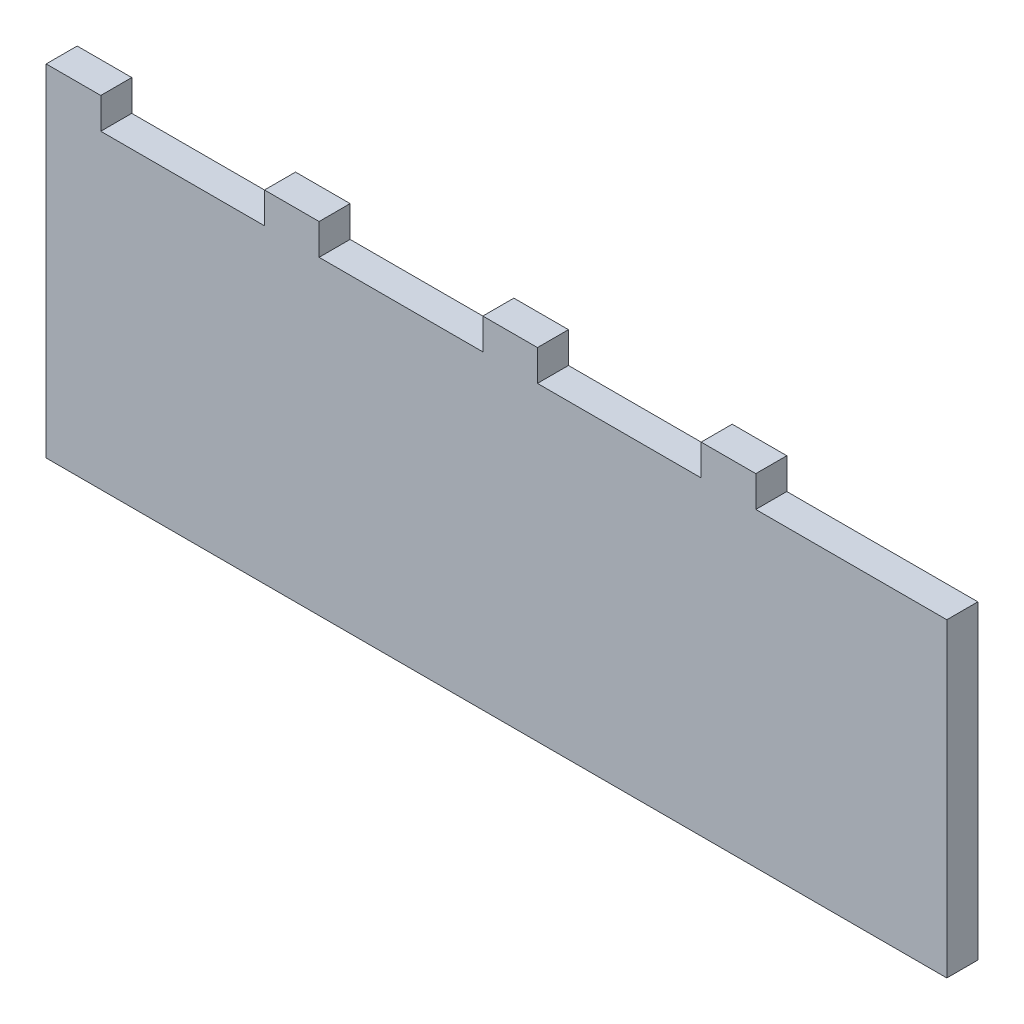
ISO-10303-21;
HEADER;
FILE_DESCRIPTION(('STEP AP214'),'2;1');
FILE_NAME('part.step','',(''),(''),'','','');
FILE_SCHEMA(('AUTOMOTIVE_DESIGN { 1 0 10303 214 1 1 1 1 }'));
ENDSEC;
DATA;
#1=APPLICATION_CONTEXT('core data for automotive mechanical design processes');
#2=APPLICATION_PROTOCOL_DEFINITION('international standard','automotive_design',2000,#1);
#3=PRODUCT_CONTEXT('',#1,'mechanical');
#4=PRODUCT('Part','Part','',(#3));
#5=PRODUCT_RELATED_PRODUCT_CATEGORY('part','',(#4));
#6=PRODUCT_DEFINITION_FORMATION('','',#4);
#7=PRODUCT_DEFINITION_CONTEXT('part definition',#1,'design');
#8=PRODUCT_DEFINITION('design','',#6,#7);
#9=PRODUCT_DEFINITION_SHAPE('','',#8);
#10=(LENGTH_UNIT() NAMED_UNIT(*) SI_UNIT(.MILLI.,.METRE.));
#11=(NAMED_UNIT(*) PLANE_ANGLE_UNIT() SI_UNIT($,.RADIAN.));
#12=(NAMED_UNIT(*) SI_UNIT($,.STERADIAN.) SOLID_ANGLE_UNIT());
#13=UNCERTAINTY_MEASURE_WITH_UNIT(LENGTH_MEASURE(1.E-05),#10,'distance_accuracy_value','');
#14=(GEOMETRIC_REPRESENTATION_CONTEXT(3) GLOBAL_UNCERTAINTY_ASSIGNED_CONTEXT((#13)) GLOBAL_UNIT_ASSIGNED_CONTEXT((#10,
#11,#12)) REPRESENTATION_CONTEXT('',''));
#15=CARTESIAN_POINT('',(0.,0.,0.));
#16=DIRECTION('',(0.,0.,1.));
#17=DIRECTION('',(1.,0.,0.));
#18=AXIS2_PLACEMENT_3D('',#15,#16,#17);
#19=CARTESIAN_POINT('',(15.39291,0.,2.5));
#20=DIRECTION('',(-1.,0.,0.));
#21=DIRECTION('',(0.,-1.,0.));
#22=AXIS2_PLACEMENT_3D('',#19,#20,#21);
#23=PLANE('',#22);
#24=DIRECTION('',(0.,1.,0.));
#25=VECTOR('',#24,1.);
#26=CARTESIAN_POINT('',(15.39291,0.,0.));
#27=LINE('',#26,#25);
#28=CARTESIAN_POINT('',(15.39291,25.,0.));
#29=VERTEX_POINT('',#28);
#30=CARTESIAN_POINT('',(15.39291,27.5,0.));
#31=VERTEX_POINT('',#30);
#32=EDGE_CURVE('E189',#29,#31,#27,.T.);
#33=ORIENTED_EDGE('',*,*,#32,.F.);
#34=DIRECTION('',(0.,0.,-1.));
#35=VECTOR('',#34,1.);
#36=CARTESIAN_POINT('',(15.39291,25.,2.5));
#37=LINE('',#36,#35);
#38=CARTESIAN_POINT('',(15.39291,25.,2.5));
#39=VERTEX_POINT('',#38);
#40=EDGE_CURVE('E11',#39,#29,#37,.T.);
#41=ORIENTED_EDGE('',*,*,#40,.F.);
#42=DIRECTION('',(0.,1.,0.));
#43=VECTOR('',#42,1.);
#44=CARTESIAN_POINT('',(15.39291,0.,2.5));
#45=LINE('',#44,#43);
#46=CARTESIAN_POINT('',(15.39291,27.5,2.5));
#47=VERTEX_POINT('',#46);
#48=EDGE_CURVE('E234',#39,#47,#45,.T.);
#49=ORIENTED_EDGE('',*,*,#48,.T.);
#50=DIRECTION('',(0.,0.,-1.));
#51=VECTOR('',#50,1.);
#52=CARTESIAN_POINT('',(15.39291,27.5,2.5));
#53=LINE('',#52,#51);
#54=EDGE_CURVE('E51',#47,#31,#53,.T.);
#55=ORIENTED_EDGE('',*,*,#54,.T.);
#56=EDGE_LOOP('',(#33,#41,#49,#55));
#57=FACE_BOUND('',#56,.T.);
#58=ADVANCED_FACE('F35',(#57),#23,.T.);
#59=CARTESIAN_POINT('',(0.,25.,2.5));
#60=DIRECTION('',(0.,-1.,0.));
#61=DIRECTION('',(0.,0.,-1.));
#62=AXIS2_PLACEMENT_3D('',#59,#60,#61);
#63=PLANE('',#62);
#64=DIRECTION('',(-1.,0.,0.));
#65=VECTOR('',#64,1.);
#66=CARTESIAN_POINT('',(0.,25.,0.));
#67=LINE('',#66,#65);
#68=CARTESIAN_POINT('',(2.19999999999999,25.,0.));
#69=VERTEX_POINT('',#68);
#70=EDGE_CURVE('E191',#29,#69,#67,.T.);
#71=ORIENTED_EDGE('',*,*,#70,.T.);
#72=DIRECTION('',(0.,0.,-1.));
#73=VECTOR('',#72,1.);
#74=CARTESIAN_POINT('',(2.19999999999999,25.,2.5));
#75=LINE('',#74,#73);
#76=CARTESIAN_POINT('',(2.19999999999999,25.,2.5));
#77=VERTEX_POINT('',#76);
#78=EDGE_CURVE('E43',#77,#69,#75,.T.);
#79=ORIENTED_EDGE('',*,*,#78,.F.);
#80=DIRECTION('',(-1.,0.,0.));
#81=VECTOR('',#80,1.);
#82=CARTESIAN_POINT('',(0.,25.,2.5));
#83=LINE('',#82,#81);
#84=EDGE_CURVE('E291',#39,#77,#83,.T.);
#85=ORIENTED_EDGE('',*,*,#84,.F.);
#86=ORIENTED_EDGE('',*,*,#40,.T.);
#87=EDGE_LOOP('',(#71,#79,#85,#86));
#88=FACE_BOUND('',#87,.T.);
#89=ADVANCED_FACE('F329',(#88),#63,.F.);
#90=CARTESIAN_POINT('',(2.19999999999993,0.,2.5));
#91=DIRECTION('',(-1.,0.,0.));
#92=DIRECTION('',(0.,-1.,0.));
#93=AXIS2_PLACEMENT_3D('',#90,#91,#92);
#94=PLANE('',#93);
#95=DIRECTION('',(0.,1.,0.));
#96=VECTOR('',#95,1.);
#97=CARTESIAN_POINT('',(2.19999999999993,0.,0.));
#98=LINE('',#97,#96);
#99=CARTESIAN_POINT('',(2.2,27.5,0.));
#100=VERTEX_POINT('',#99);
#101=EDGE_CURVE('E193',#69,#100,#98,.T.);
#102=ORIENTED_EDGE('',*,*,#101,.T.);
#103=DIRECTION('',(0.,0.,-1.));
#104=VECTOR('',#103,1.);
#105=CARTESIAN_POINT('',(2.2,27.5,2.5));
#106=LINE('',#105,#104);
#107=CARTESIAN_POINT('',(2.2,27.5,2.5));
#108=VERTEX_POINT('',#107);
#109=EDGE_CURVE('E264',#108,#100,#106,.T.);
#110=ORIENTED_EDGE('',*,*,#109,.F.);
#111=DIRECTION('',(0.,1.,0.));
#112=VECTOR('',#111,1.);
#113=CARTESIAN_POINT('',(2.19999999999993,0.,2.5));
#114=LINE('',#113,#112);
#115=EDGE_CURVE('E272',#77,#108,#114,.T.);
#116=ORIENTED_EDGE('',*,*,#115,.F.);
#117=ORIENTED_EDGE('',*,*,#78,.T.);
#118=EDGE_LOOP('',(#102,#110,#116,#117));
#119=FACE_BOUND('',#118,.T.);
#120=ADVANCED_FACE('F270',(#119),#94,.F.);
#121=CARTESIAN_POINT('',(0.,27.5,2.5));
#122=DIRECTION('',(0.,1.,0.));
#123=DIRECTION('',(0.,0.,1.));
#124=AXIS2_PLACEMENT_3D('',#121,#122,#123);
#125=PLANE('',#124);
#126=DIRECTION('',(1.,0.,0.));
#127=VECTOR('',#126,1.);
#128=CARTESIAN_POINT('',(0.,27.5,0.));
#129=LINE('',#128,#127);
#130=CARTESIAN_POINT('',(-2.2,27.5,0.));
#131=VERTEX_POINT('',#130);
#132=EDGE_CURVE('E196',#131,#100,#129,.T.);
#133=ORIENTED_EDGE('',*,*,#132,.F.);
#134=DIRECTION('',(0.,0.,-1.));
#135=VECTOR('',#134,1.);
#136=CARTESIAN_POINT('',(-2.2,27.5,2.5));
#137=LINE('',#136,#135);
#138=CARTESIAN_POINT('',(-2.2,27.5,2.5));
#139=VERTEX_POINT('',#138);
#140=EDGE_CURVE('E262',#139,#131,#137,.T.);
#141=ORIENTED_EDGE('',*,*,#140,.F.);
#142=DIRECTION('',(1.,0.,0.));
#143=VECTOR('',#142,1.);
#144=CARTESIAN_POINT('',(0.,27.5,2.5));
#145=LINE('',#144,#143);
#146=EDGE_CURVE('E284',#139,#108,#145,.T.);
#147=ORIENTED_EDGE('',*,*,#146,.T.);
#148=ORIENTED_EDGE('',*,*,#109,.T.);
#149=EDGE_LOOP('',(#133,#141,#147,#148));
#150=FACE_BOUND('',#149,.T.);
#151=ADVANCED_FACE('F281',(#150),#125,.T.);
#152=CARTESIAN_POINT('',(-2.2,0.,2.5));
#153=DIRECTION('',(-1.,0.,0.));
#154=DIRECTION('',(0.,0.,1.));
#155=AXIS2_PLACEMENT_3D('',#152,#153,#154);
#156=PLANE('',#155);
#157=DIRECTION('',(0.,1.,0.));
#158=VECTOR('',#157,1.);
#159=CARTESIAN_POINT('',(-2.2,0.,0.));
#160=LINE('',#159,#158);
#161=CARTESIAN_POINT('',(-2.2,0.,0.));
#162=VERTEX_POINT('',#161);
#163=EDGE_CURVE('E199',#162,#131,#160,.T.);
#164=ORIENTED_EDGE('',*,*,#163,.F.);
#165=DIRECTION('',(0.,0.,-1.));
#166=VECTOR('',#165,1.);
#167=CARTESIAN_POINT('',(-2.2,0.,2.5));
#168=LINE('',#167,#166);
#169=CARTESIAN_POINT('',(-2.2,0.,2.5));
#170=VERTEX_POINT('',#169);
#171=EDGE_CURVE('E260',#170,#162,#168,.T.);
#172=ORIENTED_EDGE('',*,*,#171,.F.);
#173=DIRECTION('',(0.,1.,0.));
#174=VECTOR('',#173,1.);
#175=CARTESIAN_POINT('',(-2.2,0.,2.5));
#176=LINE('',#175,#174);
#177=EDGE_CURVE('E287',#170,#139,#176,.T.);
#178=ORIENTED_EDGE('',*,*,#177,.T.);
#179=ORIENTED_EDGE('',*,*,#140,.T.);
#180=EDGE_LOOP('',(#164,#172,#178,#179));
#181=FACE_BOUND('',#180,.T.);
#182=ADVANCED_FACE('F340',(#181),#156,.T.);
#183=CARTESIAN_POINT('',(0.,0.,2.5));
#184=DIRECTION('',(0.,1.,0.));
#185=DIRECTION('',(0.,0.,1.));
#186=AXIS2_PLACEMENT_3D('',#183,#184,#185);
#187=PLANE('',#186);
#188=DIRECTION('',(1.,0.,0.));
#189=VECTOR('',#188,1.);
#190=CARTESIAN_POINT('',(0.,0.,0.));
#191=LINE('',#190,#189);
#192=CARTESIAN_POINT('',(70.3716754404114,0.,0.));
#193=VERTEX_POINT('',#192);
#194=EDGE_CURVE('E202',#162,#193,#191,.T.);
#195=ORIENTED_EDGE('',*,*,#194,.T.);
#196=DIRECTION('',(0.,0.,-1.));
#197=VECTOR('',#196,1.);
#198=CARTESIAN_POINT('',(70.3716754404114,0.,2.5));
#199=LINE('',#198,#197);
#200=CARTESIAN_POINT('',(70.3716754404114,0.,2.5));
#201=VERTEX_POINT('',#200);
#202=EDGE_CURVE('E257',#201,#193,#199,.T.);
#203=ORIENTED_EDGE('',*,*,#202,.F.);
#204=DIRECTION('',(1.,0.,0.));
#205=VECTOR('',#204,1.);
#206=CARTESIAN_POINT('',(0.,0.,2.5));
#207=LINE('',#206,#205);
#208=EDGE_CURVE('E289',#170,#201,#207,.T.);
#209=ORIENTED_EDGE('',*,*,#208,.F.);
#210=ORIENTED_EDGE('',*,*,#171,.T.);
#211=EDGE_LOOP('',(#195,#203,#209,#210));
#212=FACE_BOUND('',#211,.T.);
#213=ADVANCED_FACE('F343',(#212),#187,.F.);
#214=CARTESIAN_POINT('',(70.3716754404114,0.,2.5));
#215=DIRECTION('',(-1.,0.,0.));
#216=DIRECTION('',(0.,0.,1.));
#217=AXIS2_PLACEMENT_3D('',#214,#215,#216);
#218=PLANE('',#217);
#219=DIRECTION('',(0.,1.,0.));
#220=VECTOR('',#219,1.);
#221=CARTESIAN_POINT('',(70.3716754404114,0.,0.));
#222=LINE('',#221,#220);
#223=CARTESIAN_POINT('',(70.3716754404114,25.,0.));
#224=VERTEX_POINT('',#223);
#225=EDGE_CURVE('E204',#193,#224,#222,.T.);
#226=ORIENTED_EDGE('',*,*,#225,.T.);
#227=DIRECTION('',(0.,0.,-1.));
#228=VECTOR('',#227,1.);
#229=CARTESIAN_POINT('',(70.3716754404114,25.,2.5));
#230=LINE('',#229,#228);
#231=CARTESIAN_POINT('',(70.3716754404114,25.,2.5));
#232=VERTEX_POINT('',#231);
#233=EDGE_CURVE('E254',#232,#224,#230,.T.);
#234=ORIENTED_EDGE('',*,*,#233,.F.);
#235=DIRECTION('',(0.,1.,0.));
#236=VECTOR('',#235,1.);
#237=CARTESIAN_POINT('',(70.3716754404114,0.,2.5));
#238=LINE('',#237,#236);
#239=EDGE_CURVE('E296',#201,#232,#238,.T.);
#240=ORIENTED_EDGE('',*,*,#239,.F.);
#241=ORIENTED_EDGE('',*,*,#202,.T.);
#242=EDGE_LOOP('',(#226,#234,#240,#241));
#243=FACE_BOUND('',#242,.T.);
#244=ADVANCED_FACE('F347',(#243),#218,.F.);
#245=CARTESIAN_POINT('',(0.,25.,2.5));
#246=DIRECTION('',(0.,-1.,0.));
#247=DIRECTION('',(0.,0.,-1.));
#248=AXIS2_PLACEMENT_3D('',#245,#246,#247);
#249=PLANE('',#248);
#250=DIRECTION('',(-1.,0.,0.));
#251=VECTOR('',#250,1.);
#252=CARTESIAN_POINT('',(0.,25.,0.));
#253=LINE('',#252,#251);
#254=CARTESIAN_POINT('',(54.97873,25.,0.));
#255=VERTEX_POINT('',#254);
#256=EDGE_CURVE('E206',#224,#255,#253,.T.);
#257=ORIENTED_EDGE('',*,*,#256,.T.);
#258=DIRECTION('',(0.,0.,-1.));
#259=VECTOR('',#258,1.);
#260=CARTESIAN_POINT('',(54.97873,25.,2.5));
#261=LINE('',#260,#259);
#262=CARTESIAN_POINT('',(54.97873,25.,2.5));
#263=VERTEX_POINT('',#262);
#264=EDGE_CURVE('E251',#263,#255,#261,.T.);
#265=ORIENTED_EDGE('',*,*,#264,.F.);
#266=DIRECTION('',(-1.,0.,0.));
#267=VECTOR('',#266,1.);
#268=CARTESIAN_POINT('',(0.,25.,2.5));
#269=LINE('',#268,#267);
#270=EDGE_CURVE('E298',#232,#263,#269,.T.);
#271=ORIENTED_EDGE('',*,*,#270,.F.);
#272=ORIENTED_EDGE('',*,*,#233,.T.);
#273=EDGE_LOOP('',(#257,#265,#271,#272));
#274=FACE_BOUND('',#273,.T.);
#275=ADVANCED_FACE('F351',(#274),#249,.F.);
#276=CARTESIAN_POINT('',(54.97873,0.,2.5));
#277=DIRECTION('',(-1.,0.,0.));
#278=DIRECTION('',(0.,0.,1.));
#279=AXIS2_PLACEMENT_3D('',#276,#277,#278);
#280=PLANE('',#279);
#281=DIRECTION('',(0.,1.,0.));
#282=VECTOR('',#281,1.);
#283=CARTESIAN_POINT('',(54.97873,0.,0.));
#284=LINE('',#283,#282);
#285=CARTESIAN_POINT('',(54.97873,27.5,0.));
#286=VERTEX_POINT('',#285);
#287=EDGE_CURVE('E208',#255,#286,#284,.T.);
#288=ORIENTED_EDGE('',*,*,#287,.T.);
#289=DIRECTION('',(0.,0.,-1.));
#290=VECTOR('',#289,1.);
#291=CARTESIAN_POINT('',(54.97873,27.5,2.5));
#292=LINE('',#291,#290);
#293=CARTESIAN_POINT('',(54.97873,27.5,2.5));
#294=VERTEX_POINT('',#293);
#295=EDGE_CURVE('E249',#294,#286,#292,.T.);
#296=ORIENTED_EDGE('',*,*,#295,.F.);
#297=DIRECTION('',(0.,1.,0.));
#298=VECTOR('',#297,1.);
#299=CARTESIAN_POINT('',(54.97873,0.,2.5));
#300=LINE('',#299,#298);
#301=EDGE_CURVE('E300',#263,#294,#300,.T.);
#302=ORIENTED_EDGE('',*,*,#301,.F.);
#303=ORIENTED_EDGE('',*,*,#264,.T.);
#304=EDGE_LOOP('',(#288,#296,#302,#303));
#305=FACE_BOUND('',#304,.T.);
#306=ADVANCED_FACE('F355',(#305),#280,.F.);
#307=CARTESIAN_POINT('',(0.,27.5,2.5));
#308=DIRECTION('',(0.,1.,0.));
#309=DIRECTION('',(0.,0.,1.));
#310=AXIS2_PLACEMENT_3D('',#307,#308,#309);
#311=PLANE('',#310);
#312=DIRECTION('',(1.,0.,0.));
#313=VECTOR('',#312,1.);
#314=CARTESIAN_POINT('',(0.,27.5,0.));
#315=LINE('',#314,#313);
#316=CARTESIAN_POINT('',(50.57873,27.5,0.));
#317=VERTEX_POINT('',#316);
#318=EDGE_CURVE('E211',#317,#286,#315,.T.);
#319=ORIENTED_EDGE('',*,*,#318,.F.);
#320=DIRECTION('',(0.,0.,-1.));
#321=VECTOR('',#320,1.);
#322=CARTESIAN_POINT('',(50.57873,27.5,2.5));
#323=LINE('',#322,#321);
#324=CARTESIAN_POINT('',(50.57873,27.5,2.5));
#325=VERTEX_POINT('',#324);
#326=EDGE_CURVE('E247',#325,#317,#323,.T.);
#327=ORIENTED_EDGE('',*,*,#326,.F.);
#328=DIRECTION('',(1.,0.,0.));
#329=VECTOR('',#328,1.);
#330=CARTESIAN_POINT('',(0.,27.5,2.5));
#331=LINE('',#330,#329);
#332=EDGE_CURVE('E302',#325,#294,#331,.T.);
#333=ORIENTED_EDGE('',*,*,#332,.T.);
#334=ORIENTED_EDGE('',*,*,#295,.T.);
#335=EDGE_LOOP('',(#319,#327,#333,#334));
#336=FACE_BOUND('',#335,.T.);
#337=ADVANCED_FACE('F359',(#336),#311,.T.);
#338=CARTESIAN_POINT('',(50.57873,0.,2.5));
#339=DIRECTION('',(-1.,0.,0.));
#340=DIRECTION('',(0.,0.,1.));
#341=AXIS2_PLACEMENT_3D('',#338,#339,#340);
#342=PLANE('',#341);
#343=DIRECTION('',(0.,1.,0.));
#344=VECTOR('',#343,1.);
#345=CARTESIAN_POINT('',(50.57873,0.,0.));
#346=LINE('',#345,#344);
#347=CARTESIAN_POINT('',(50.57873,25.,0.));
#348=VERTEX_POINT('',#347);
#349=EDGE_CURVE('E214',#348,#317,#346,.T.);
#350=ORIENTED_EDGE('',*,*,#349,.F.);
#351=DIRECTION('',(0.,0.,-1.));
#352=VECTOR('',#351,1.);
#353=CARTESIAN_POINT('',(50.57873,25.,2.5));
#354=LINE('',#353,#352);
#355=CARTESIAN_POINT('',(50.57873,25.,2.5));
#356=VERTEX_POINT('',#355);
#357=EDGE_CURVE('E245',#356,#348,#354,.T.);
#358=ORIENTED_EDGE('',*,*,#357,.F.);
#359=DIRECTION('',(0.,1.,0.));
#360=VECTOR('',#359,1.);
#361=CARTESIAN_POINT('',(50.57873,0.,2.5));
#362=LINE('',#361,#360);
#363=EDGE_CURVE('E305',#356,#325,#362,.T.);
#364=ORIENTED_EDGE('',*,*,#363,.T.);
#365=ORIENTED_EDGE('',*,*,#326,.T.);
#366=EDGE_LOOP('',(#350,#358,#364,#365));
#367=FACE_BOUND('',#366,.T.);
#368=ADVANCED_FACE('F363',(#367),#342,.T.);
#369=CARTESIAN_POINT('',(0.,25.,2.5));
#370=DIRECTION('',(0.,-1.,0.));
#371=DIRECTION('',(0.,0.,-1.));
#372=AXIS2_PLACEMENT_3D('',#369,#370,#371);
#373=PLANE('',#372);
#374=DIRECTION('',(-1.,0.,0.));
#375=VECTOR('',#374,1.);
#376=CARTESIAN_POINT('',(0.,25.,0.));
#377=LINE('',#376,#375);
#378=CARTESIAN_POINT('',(37.38582,25.,0.));
#379=VERTEX_POINT('',#378);
#380=EDGE_CURVE('E217',#348,#379,#377,.T.);
#381=ORIENTED_EDGE('',*,*,#380,.T.);
#382=DIRECTION('',(0.,0.,-1.));
#383=VECTOR('',#382,1.);
#384=CARTESIAN_POINT('',(37.38582,25.,2.5));
#385=LINE('',#384,#383);
#386=CARTESIAN_POINT('',(37.38582,25.,2.5));
#387=VERTEX_POINT('',#386);
#388=EDGE_CURVE('E242',#387,#379,#385,.T.);
#389=ORIENTED_EDGE('',*,*,#388,.F.);
#390=DIRECTION('',(-1.,0.,0.));
#391=VECTOR('',#390,1.);
#392=CARTESIAN_POINT('',(0.,25.,2.5));
#393=LINE('',#392,#391);
#394=EDGE_CURVE('E308',#356,#387,#393,.T.);
#395=ORIENTED_EDGE('',*,*,#394,.F.);
#396=ORIENTED_EDGE('',*,*,#357,.T.);
#397=EDGE_LOOP('',(#381,#389,#395,#396));
#398=FACE_BOUND('',#397,.T.);
#399=ADVANCED_FACE('F367',(#398),#373,.F.);
#400=CARTESIAN_POINT('',(37.38582,0.,2.5));
#401=DIRECTION('',(-1.,0.,0.));
#402=DIRECTION('',(0.,0.,1.));
#403=AXIS2_PLACEMENT_3D('',#400,#401,#402);
#404=PLANE('',#403);
#405=DIRECTION('',(0.,1.,0.));
#406=VECTOR('',#405,1.);
#407=CARTESIAN_POINT('',(37.38582,0.,0.));
#408=LINE('',#407,#406);
#409=CARTESIAN_POINT('',(37.38582,27.5,0.));
#410=VERTEX_POINT('',#409);
#411=EDGE_CURVE('E219',#379,#410,#408,.T.);
#412=ORIENTED_EDGE('',*,*,#411,.T.);
#413=DIRECTION('',(0.,0.,-1.));
#414=VECTOR('',#413,1.);
#415=CARTESIAN_POINT('',(37.38582,27.5,2.5));
#416=LINE('',#415,#414);
#417=CARTESIAN_POINT('',(37.38582,27.5,2.5));
#418=VERTEX_POINT('',#417);
#419=EDGE_CURVE('E240',#418,#410,#416,.T.);
#420=ORIENTED_EDGE('',*,*,#419,.F.);
#421=DIRECTION('',(0.,1.,0.));
#422=VECTOR('',#421,1.);
#423=CARTESIAN_POINT('',(37.38582,0.,2.5));
#424=LINE('',#423,#422);
#425=EDGE_CURVE('E310',#387,#418,#424,.T.);
#426=ORIENTED_EDGE('',*,*,#425,.F.);
#427=ORIENTED_EDGE('',*,*,#388,.T.);
#428=EDGE_LOOP('',(#412,#420,#426,#427));
#429=FACE_BOUND('',#428,.T.);
#430=ADVANCED_FACE('F371',(#429),#404,.F.);
#431=CARTESIAN_POINT('',(0.,27.5,2.5));
#432=DIRECTION('',(0.,1.,0.));
#433=DIRECTION('',(0.,0.,1.));
#434=AXIS2_PLACEMENT_3D('',#431,#432,#433);
#435=PLANE('',#434);
#436=DIRECTION('',(1.,0.,0.));
#437=VECTOR('',#436,1.);
#438=CARTESIAN_POINT('',(0.,27.5,0.));
#439=LINE('',#438,#437);
#440=CARTESIAN_POINT('',(32.98582,27.5,0.));
#441=VERTEX_POINT('',#440);
#442=EDGE_CURVE('E222',#441,#410,#439,.T.);
#443=ORIENTED_EDGE('',*,*,#442,.F.);
#444=DIRECTION('',(0.,0.,-1.));
#445=VECTOR('',#444,1.);
#446=CARTESIAN_POINT('',(32.98582,27.5,2.5));
#447=LINE('',#446,#445);
#448=CARTESIAN_POINT('',(32.98582,27.5,2.5));
#449=VERTEX_POINT('',#448);
#450=EDGE_CURVE('E238',#449,#441,#447,.T.);
#451=ORIENTED_EDGE('',*,*,#450,.F.);
#452=DIRECTION('',(1.,0.,0.));
#453=VECTOR('',#452,1.);
#454=CARTESIAN_POINT('',(0.,27.5,2.5));
#455=LINE('',#454,#453);
#456=EDGE_CURVE('E312',#449,#418,#455,.T.);
#457=ORIENTED_EDGE('',*,*,#456,.T.);
#458=ORIENTED_EDGE('',*,*,#419,.T.);
#459=EDGE_LOOP('',(#443,#451,#457,#458));
#460=FACE_BOUND('',#459,.T.);
#461=ADVANCED_FACE('F375',(#460),#435,.T.);
#462=CARTESIAN_POINT('',(32.98582,0.,2.5));
#463=DIRECTION('',(-1.,0.,0.));
#464=DIRECTION('',(0.,0.,1.));
#465=AXIS2_PLACEMENT_3D('',#462,#463,#464);
#466=PLANE('',#465);
#467=DIRECTION('',(0.,1.,0.));
#468=VECTOR('',#467,1.);
#469=CARTESIAN_POINT('',(32.98582,0.,0.));
#470=LINE('',#469,#468);
#471=CARTESIAN_POINT('',(32.98582,25.,0.));
#472=VERTEX_POINT('',#471);
#473=EDGE_CURVE('E225',#472,#441,#470,.T.);
#474=ORIENTED_EDGE('',*,*,#473,.F.);
#475=DIRECTION('',(0.,0.,-1.));
#476=VECTOR('',#475,1.);
#477=CARTESIAN_POINT('',(32.98582,25.,2.5));
#478=LINE('',#477,#476);
#479=CARTESIAN_POINT('',(32.98582,25.,2.5));
#480=VERTEX_POINT('',#479);
#481=EDGE_CURVE('E181',#480,#472,#478,.T.);
#482=ORIENTED_EDGE('',*,*,#481,.F.);
#483=DIRECTION('',(0.,1.,0.));
#484=VECTOR('',#483,1.);
#485=CARTESIAN_POINT('',(32.98582,0.,2.5));
#486=LINE('',#485,#484);
#487=EDGE_CURVE('E171',#480,#449,#486,.T.);
#488=ORIENTED_EDGE('',*,*,#487,.T.);
#489=ORIENTED_EDGE('',*,*,#450,.T.);
#490=EDGE_LOOP('',(#474,#482,#488,#489));
#491=FACE_BOUND('',#490,.T.);
#492=ADVANCED_FACE('F316',(#491),#466,.T.);
#493=CARTESIAN_POINT('',(0.,25.,2.5));
#494=DIRECTION('',(0.,-1.,0.));
#495=DIRECTION('',(0.,0.,-1.));
#496=AXIS2_PLACEMENT_3D('',#493,#494,#495);
#497=PLANE('',#496);
#498=DIRECTION('',(-1.,0.,0.));
#499=VECTOR('',#498,1.);
#500=CARTESIAN_POINT('',(0.,25.,0.));
#501=LINE('',#500,#499);
#502=CARTESIAN_POINT('',(19.79291,25.,0.));
#503=VERTEX_POINT('',#502);
#504=EDGE_CURVE('E178',#472,#503,#501,.T.);
#505=ORIENTED_EDGE('',*,*,#504,.T.);
#506=DIRECTION('',(0.,0.,-1.));
#507=VECTOR('',#506,1.);
#508=CARTESIAN_POINT('',(19.79291,25.,2.5));
#509=LINE('',#508,#507);
#510=CARTESIAN_POINT('',(19.79291,25.,2.5));
#511=VERTEX_POINT('',#510);
#512=EDGE_CURVE('E175',#511,#503,#509,.T.);
#513=ORIENTED_EDGE('',*,*,#512,.F.);
#514=DIRECTION('',(-1.,0.,0.));
#515=VECTOR('',#514,1.);
#516=CARTESIAN_POINT('',(0.,25.,2.5));
#517=LINE('',#516,#515);
#518=EDGE_CURVE('E162',#480,#511,#517,.T.);
#519=ORIENTED_EDGE('',*,*,#518,.F.);
#520=ORIENTED_EDGE('',*,*,#481,.T.);
#521=EDGE_LOOP('',(#505,#513,#519,#520));
#522=FACE_BOUND('',#521,.T.);
#523=ADVANCED_FACE('F176',(#522),#497,.F.);
#524=CARTESIAN_POINT('',(19.79291,0.,2.5));
#525=DIRECTION('',(-1.,0.,0.));
#526=DIRECTION('',(0.,-1.,0.));
#527=AXIS2_PLACEMENT_3D('',#524,#525,#526);
#528=PLANE('',#527);
#529=DIRECTION('',(0.,1.,0.));
#530=VECTOR('',#529,1.);
#531=CARTESIAN_POINT('',(19.79291,0.,0.));
#532=LINE('',#531,#530);
#533=CARTESIAN_POINT('',(19.79291,27.5,0.));
#534=VERTEX_POINT('',#533);
#535=EDGE_CURVE('E229',#503,#534,#532,.T.);
#536=ORIENTED_EDGE('',*,*,#535,.T.);
#537=DIRECTION('',(0.,0.,-1.));
#538=VECTOR('',#537,1.);
#539=CARTESIAN_POINT('',(19.79291,27.5,2.5));
#540=LINE('',#539,#538);
#541=CARTESIAN_POINT('',(19.79291,27.5,2.5));
#542=VERTEX_POINT('',#541);
#543=EDGE_CURVE('E107',#542,#534,#540,.T.);
#544=ORIENTED_EDGE('',*,*,#543,.F.);
#545=DIRECTION('',(0.,1.,0.));
#546=VECTOR('',#545,1.);
#547=CARTESIAN_POINT('',(19.79291,0.,2.5));
#548=LINE('',#547,#546);
#549=EDGE_CURVE('E168',#511,#542,#548,.T.);
#550=ORIENTED_EDGE('',*,*,#549,.F.);
#551=ORIENTED_EDGE('',*,*,#512,.T.);
#552=EDGE_LOOP('',(#536,#544,#550,#551));
#553=FACE_BOUND('',#552,.T.);
#554=ADVANCED_FACE('F183',(#553),#528,.F.);
#555=CARTESIAN_POINT('',(0.,27.5,2.5));
#556=DIRECTION('',(0.,1.,0.));
#557=DIRECTION('',(0.,0.,1.));
#558=AXIS2_PLACEMENT_3D('',#555,#556,#557);
#559=PLANE('',#558);
#560=DIRECTION('',(1.,0.,0.));
#561=VECTOR('',#560,1.);
#562=CARTESIAN_POINT('',(0.,27.5,0.));
#563=LINE('',#562,#561);
#564=EDGE_CURVE('E231',#31,#534,#563,.T.);
#565=ORIENTED_EDGE('',*,*,#564,.F.);
#566=ORIENTED_EDGE('',*,*,#54,.F.);
#567=DIRECTION('',(1.,0.,0.));
#568=VECTOR('',#567,1.);
#569=CARTESIAN_POINT('',(0.,27.5,2.5));
#570=LINE('',#569,#568);
#571=EDGE_CURVE('E184',#47,#542,#570,.T.);
#572=ORIENTED_EDGE('',*,*,#571,.T.);
#573=ORIENTED_EDGE('',*,*,#543,.T.);
#574=EDGE_LOOP('',(#565,#566,#572,#573));
#575=FACE_BOUND('',#574,.T.);
#576=ADVANCED_FACE('F318',(#575),#559,.T.);
#577=CARTESIAN_POINT('',(0.,0.,2.5));
#578=DIRECTION('',(0.,0.,1.));
#579=DIRECTION('',(1.,0.,0.));
#580=AXIS2_PLACEMENT_3D('',#577,#578,#579);
#581=PLANE('',#580);
#582=ORIENTED_EDGE('',*,*,#48,.F.);
#583=ORIENTED_EDGE('',*,*,#84,.T.);
#584=ORIENTED_EDGE('',*,*,#115,.T.);
#585=ORIENTED_EDGE('',*,*,#146,.F.);
#586=ORIENTED_EDGE('',*,*,#177,.F.);
#587=ORIENTED_EDGE('',*,*,#208,.T.);
#588=ORIENTED_EDGE('',*,*,#239,.T.);
#589=ORIENTED_EDGE('',*,*,#270,.T.);
#590=ORIENTED_EDGE('',*,*,#301,.T.);
#591=ORIENTED_EDGE('',*,*,#332,.F.);
#592=ORIENTED_EDGE('',*,*,#363,.F.);
#593=ORIENTED_EDGE('',*,*,#394,.T.);
#594=ORIENTED_EDGE('',*,*,#425,.T.);
#595=ORIENTED_EDGE('',*,*,#456,.F.);
#596=ORIENTED_EDGE('',*,*,#487,.F.);
#597=ORIENTED_EDGE('',*,*,#518,.T.);
#598=ORIENTED_EDGE('',*,*,#549,.T.);
#599=ORIENTED_EDGE('',*,*,#571,.F.);
#600=EDGE_LOOP('',(#582,#583,#584,#585,#586,#587,#588,#589,#590,#591,#592,#593,#594,#595,#596,
#597,#598,#599));
#601=FACE_BOUND('',#600,.T.);
#602=ADVANCED_FACE('F165',(#601),#581,.T.);
#603=CARTESIAN_POINT('',(0.,0.,0.));
#604=DIRECTION('',(0.,0.,1.));
#605=DIRECTION('',(1.,0.,0.));
#606=AXIS2_PLACEMENT_3D('',#603,#604,#605);
#607=PLANE('',#606);
#608=ORIENTED_EDGE('',*,*,#32,.T.);
#609=ORIENTED_EDGE('',*,*,#564,.T.);
#610=ORIENTED_EDGE('',*,*,#535,.F.);
#611=ORIENTED_EDGE('',*,*,#504,.F.);
#612=ORIENTED_EDGE('',*,*,#473,.T.);
#613=ORIENTED_EDGE('',*,*,#442,.T.);
#614=ORIENTED_EDGE('',*,*,#411,.F.);
#615=ORIENTED_EDGE('',*,*,#380,.F.);
#616=ORIENTED_EDGE('',*,*,#349,.T.);
#617=ORIENTED_EDGE('',*,*,#318,.T.);
#618=ORIENTED_EDGE('',*,*,#287,.F.);
#619=ORIENTED_EDGE('',*,*,#256,.F.);
#620=ORIENTED_EDGE('',*,*,#225,.F.);
#621=ORIENTED_EDGE('',*,*,#194,.F.);
#622=ORIENTED_EDGE('',*,*,#163,.T.);
#623=ORIENTED_EDGE('',*,*,#132,.T.);
#624=ORIENTED_EDGE('',*,*,#101,.F.);
#625=ORIENTED_EDGE('',*,*,#70,.F.);
#626=EDGE_LOOP('',(#608,#609,#610,#611,#612,#613,#614,#615,#616,#617,#618,#619,#620,#621,#622,
#623,#624,#625));
#627=FACE_BOUND('',#626,.T.);
#628=ADVANCED_FACE('F276',(#627),#607,.F.);
#629=CLOSED_SHELL('',(#58,#89,#120,#151,#182,#213,#244,#275,#306,#337,#368,#399,#430,#461,#492,
#523,#554,#576,#602,#628));
#630=MANIFOLD_SOLID_BREP('B2',#629);
#631=ADVANCED_BREP_SHAPE_REPRESENTATION('',(#18,#630),#14);
#632=SHAPE_DEFINITION_REPRESENTATION(#9,#631);
ENDSEC;
END-ISO-10303-21;
